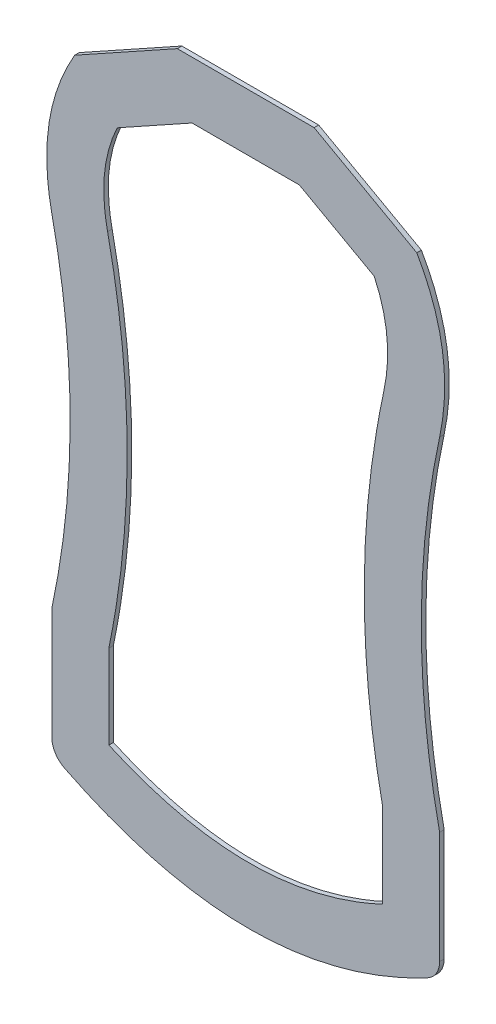
ISO-10303-21;
HEADER;
FILE_DESCRIPTION(('STEP AP214'),'2;1');
FILE_NAME('part.step','',(''),(''),'','','');
FILE_SCHEMA(('AUTOMOTIVE_DESIGN { 1 0 10303 214 1 1 1 1 }'));
ENDSEC;
DATA;
#1=APPLICATION_CONTEXT('core data for automotive mechanical design processes');
#2=APPLICATION_PROTOCOL_DEFINITION('international standard','automotive_design',2000,#1);
#3=PRODUCT_CONTEXT('',#1,'mechanical');
#4=PRODUCT('Part','Part','',(#3));
#5=PRODUCT_RELATED_PRODUCT_CATEGORY('part','',(#4));
#6=PRODUCT_DEFINITION_FORMATION('','',#4);
#7=PRODUCT_DEFINITION_CONTEXT('part definition',#1,'design');
#8=PRODUCT_DEFINITION('design','',#6,#7);
#9=PRODUCT_DEFINITION_SHAPE('','',#8);
#10=(LENGTH_UNIT() NAMED_UNIT(*) SI_UNIT(.MILLI.,.METRE.));
#11=(NAMED_UNIT(*) PLANE_ANGLE_UNIT() SI_UNIT($,.RADIAN.));
#12=(NAMED_UNIT(*) SI_UNIT($,.STERADIAN.) SOLID_ANGLE_UNIT());
#13=UNCERTAINTY_MEASURE_WITH_UNIT(LENGTH_MEASURE(1.E-05),#10,'distance_accuracy_value','');
#14=(GEOMETRIC_REPRESENTATION_CONTEXT(3) GLOBAL_UNCERTAINTY_ASSIGNED_CONTEXT((#13)) GLOBAL_UNIT_ASSIGNED_CONTEXT((#10,
#11,#12)) REPRESENTATION_CONTEXT('',''));
#15=CARTESIAN_POINT('',(0.,0.,0.));
#16=DIRECTION('',(0.,0.,1.));
#17=DIRECTION('',(1.,0.,0.));
#18=AXIS2_PLACEMENT_3D('',#15,#16,#17);
#19=CARTESIAN_POINT('',(-76.9738187891846,121.143252381259,2.));
#20=DIRECTION('',(0.,0.,1.));
#21=DIRECTION('',(1.,0.,0.));
#22=AXIS2_PLACEMENT_3D('',#19,#20,#21);
#23=PLANE('',#22);
#24=CARTESIAN_POINT('',(-1000238.87552942,19516.7154582189,2.));
#25=CARTESIAN_POINT('',(999898.092641495,7182.76188768329,2.));
#26=CARTESIAN_POINT('',(-999865.205028728,-33397.6662240604,2.));
#27=B_SPLINE_CURVE_WITH_KNOTS('',2,(#24,#25,#26),.UNSPECIFIED.,.F.,.F.,(3,3),(0.,1.),.UNSPECIFIED.);
#28=CARTESIAN_POINT('',(-84.9999999975347,193.614820304158,2.));
#29=VERTEX_POINT('',#28);
#30=CARTESIAN_POINT('',(-85.,43.6148203161552,2.));
#31=VERTEX_POINT('',#30);
#32=EDGE_CURVE('E312',#29,#31,#27,.T.);
#33=ORIENTED_EDGE('',*,*,#32,.T.);
#34=DIRECTION('',(0.,-1.,0.));
#35=VECTOR('',#34,1.);
#36=CARTESIAN_POINT('',(-85.,43.6148203161552,2.));
#37=LINE('',#36,#35);
#38=CARTESIAN_POINT('',(-85.,-5.29765057148733,2.));
#39=VERTEX_POINT('',#38);
#40=EDGE_CURVE('E415',#31,#39,#37,.T.);
#41=ORIENTED_EDGE('',*,*,#40,.T.);
#42=CARTESIAN_POINT('',(-75.,-5.29765057148733,2.));
#43=DIRECTION('',(0.,0.,1.));
#44=DIRECTION('',(1.,0.,0.));
#45=AXIS2_PLACEMENT_3D('',#42,#43,#44);
#46=CIRCLE('',#45,9.99999999999998);
#47=CARTESIAN_POINT('',(-79.4757984005765,-14.2400903212087,2.));
#48=VERTEX_POINT('',#47);
#49=EDGE_CURVE('E351',#39,#48,#46,.T.);
#50=ORIENTED_EDGE('',*,*,#49,.T.);
#51=CARTESIAN_POINT('',(-77869.890217819,997082.106704273,2.));
#52=CARTESIAN_POINT('',(60403.4764562875,-998209.20519559,2.));
#53=CARTESIAN_POINT('',(-42894.2550306342,999198.244961769,2.));
#54=B_SPLINE_CURVE_WITH_KNOTS('',2,(#51,#52,#53),.UNSPECIFIED.,.F.,.F.,(3,3),(0.,1.),.UNSPECIFIED.);
#55=CARTESIAN_POINT('',(79.6959362439127,-14.3068048238395,2.));
#56=VERTEX_POINT('',#55);
#57=EDGE_CURVE('E369',#48,#56,#54,.T.);
#58=ORIENTED_EDGE('',*,*,#57,.T.);
#59=CARTESIAN_POINT('',(75.,-5.47797801665959,2.));
#60=DIRECTION('',(0.,0.,1.));
#61=DIRECTION('',(1.,0.,0.));
#62=AXIS2_PLACEMENT_3D('',#59,#60,#61);
#63=CIRCLE('',#62,9.99999999999376);
#64=CARTESIAN_POINT('',(84.9999999999938,-5.47797801665959,2.));
#65=VERTEX_POINT('',#64);
#66=EDGE_CURVE('E366',#56,#65,#63,.T.);
#67=ORIENTED_EDGE('',*,*,#66,.T.);
#68=DIRECTION('',(0.,1.,0.));
#69=VECTOR('',#68,1.);
#70=CARTESIAN_POINT('',(85.,-5.47797801665959,2.));
#71=LINE('',#70,#69);
#72=CARTESIAN_POINT('',(85.,43.6148203161552,2.));
#73=VERTEX_POINT('',#72);
#74=EDGE_CURVE('E368',#65,#73,#71,.T.);
#75=ORIENTED_EDGE('',*,*,#74,.T.);
#76=CARTESIAN_POINT('',(999865.205028728,-33397.6662240645,2.));
#77=CARTESIAN_POINT('',(-999898.092641495,7182.76188768427,2.));
#78=CARTESIAN_POINT('',(1000238.87552942,19516.7154582207,2.));
#79=B_SPLINE_CURVE_WITH_KNOTS('',2,(#76,#77,#78),.UNSPECIFIED.,.F.,.F.,(3,3),(0.,1.),.UNSPECIFIED.);
#80=CARTESIAN_POINT('',(85.0000000003506,193.614820317745,2.));
#81=VERTEX_POINT('',#80);
#82=EDGE_CURVE('E371',#73,#81,#79,.T.);
#83=ORIENTED_EDGE('',*,*,#82,.T.);
#84=CARTESIAN_POINT('',(-979400.541261937,-201703.6557811,2.));
#85=CARTESIAN_POINT('',(982042.052969955,189337.995737097,2.));
#86=CARTESIAN_POINT('',(-984340.899723838,-176050.437364522,2.));
#87=B_SPLINE_CURVE_WITH_KNOTS('',2,(#84,#85,#86),.UNSPECIFIED.,.F.,.F.,(3,3),(0.,1.),.UNSPECIFIED.);
#88=CARTESIAN_POINT('',(74.9999998616335,258.614820554969,2.));
#89=VERTEX_POINT('',#88);
#90=EDGE_CURVE('E383',#81,#89,#87,.T.);
#91=ORIENTED_EDGE('',*,*,#90,.T.);
#92=DIRECTION('',(-0.87415727678954,0.485642929976229,0.));
#93=VECTOR('',#92,1.);
#94=CARTESIAN_POINT('',(74.9999999308137,258.614820435594,2.));
#95=LINE('',#94,#93);
#96=CARTESIAN_POINT('',(30.,283.614820316155,2.));
#97=VERTEX_POINT('',#96);
#98=EDGE_CURVE('E439',#89,#97,#95,.T.);
#99=ORIENTED_EDGE('',*,*,#98,.T.);
#100=DIRECTION('',(-1.,0.,0.));
#101=VECTOR('',#100,1.);
#102=CARTESIAN_POINT('',(30.,283.614820316155,2.));
#103=LINE('',#102,#101);
#104=CARTESIAN_POINT('',(-30.,283.614820316155,2.));
#105=VERTEX_POINT('',#104);
#106=EDGE_CURVE('E430',#97,#105,#103,.T.);
#107=ORIENTED_EDGE('',*,*,#106,.T.);
#108=DIRECTION('',(-0.874157276121537,-0.485642931178634,0.));
#109=VECTOR('',#108,1.);
#110=CARTESIAN_POINT('',(-30.,283.614820316155,2.));
#111=LINE('',#110,#109);
#112=CARTESIAN_POINT('',(-75.,258.614820316155,2.));
#113=VERTEX_POINT('',#112);
#114=EDGE_CURVE('E261',#105,#113,#111,.T.);
#115=ORIENTED_EDGE('',*,*,#114,.T.);
#116=CARTESIAN_POINT('',(984340.899723838,-176050.437364521,2.));
#117=CARTESIAN_POINT('',(-982042.052969956,189337.995737094,2.));
#118=CARTESIAN_POINT('',(979400.541261938,-201703.655781094,2.));
#119=B_SPLINE_CURVE_WITH_KNOTS('',2,(#116,#117,#118),.UNSPECIFIED.,.F.,.F.,(3,3),(0.,1.),.UNSPECIFIED.);
#120=EDGE_CURVE('E254',#113,#29,#119,.T.);
#121=ORIENTED_EDGE('',*,*,#120,.T.);
#122=EDGE_LOOP('',(#33,#41,#50,#58,#67,#75,#83,#91,#99,#107,#115,#121));
#123=FACE_BOUND('',#122,.T.);
#124=DIRECTION('',(-8.52301327763965E-12,1.,0.));
#125=VECTOR('',#124,1.);
#126=CARTESIAN_POINT('',(60.0000000000006,3.79043038604827,2.));
#127=LINE('',#126,#125);
#128=CARTESIAN_POINT('',(60.0000000000006,3.79043038604827,2.));
#129=VERTEX_POINT('',#128);
#130=CARTESIAN_POINT('',(59.9999999996833,41.0135529890441,2.));
#131=VERTEX_POINT('',#130);
#132=EDGE_CURVE('E197',#129,#131,#127,.T.);
#133=ORIENTED_EDGE('',*,*,#132,.F.);
#134=CARTESIAN_POINT('',(-59.9999999985744,4.19691995283315,2.));
#135=CARTESIAN_POINT('',(-58.6755498252806,3.60723733508615,2.));
#136=CARTESIAN_POINT('',(-55.9979113155388,2.4511079803945,2.));
#137=CARTESIAN_POINT('',(-50.7144017792948,0.31362506621307,2.));
#138=CARTESIAN_POINT('',(-44.1582719851266,-2.07138511945108,2.));
#139=CARTESIAN_POINT('',(-36.3927742100887,-4.47105772516419,2.));
#140=CARTESIAN_POINT('',(-26.159032522355,-7.07010000079152,2.));
#141=CARTESIAN_POINT('',(-13.5817743786078,-9.21291655889772,2.));
#142=CARTESIAN_POINT('',(1.24439365844762,-10.0745525897548,2.));
#143=CARTESIAN_POINT('',(15.907593171899,-9.25837708174665,2.));
#144=CARTESIAN_POINT('',(28.0853923629384,-7.17597824513762,2.));
#145=CARTESIAN_POINT('',(37.8532748668454,-4.64734988569241,2.));
#146=CARTESIAN_POINT('',(45.2002411230977,-2.31212286898567,2.));
#147=CARTESIAN_POINT('',(51.3517864480515,0.00897374498053062,2.));
#148=CARTESIAN_POINT('',(56.2823816259972,2.09043393425648,2.));
#149=CARTESIAN_POINT('',(58.7696713385722,3.21546819865244,2.));
#150=CARTESIAN_POINT('',(59.999999999674,3.79043038587958,2.));
#151=B_SPLINE_CURVE_WITH_KNOTS('',3,(#134,#135,#136,#137,#138,#139,#140,#141,#142,#143,#144,
#145,#146,#147,#148,#149,#150),.UNSPECIFIED.,.F.,.F.,(4,1,1,1,1,1,1,1,1,1,1,1,1,1,4),
(0.497723600916003,0.497848890223069,0.497974179530135,0.498224758144267,0.498475336758399,
0.498725915372531,0.499227072600795,0.49972822982906,0.500229387057324,0.500730544285588,
0.50098112289972,0.501231701513852,0.501482280127984,0.50160756943505,0.501732858742116),.UNSPECIFIED.);
#152=CARTESIAN_POINT('',(-60.,4.19691995348408,2.));
#153=VERTEX_POINT('',#152);
#154=EDGE_CURVE('E189',#153,#129,#151,.T.);
#155=ORIENTED_EDGE('',*,*,#154,.F.);
#156=DIRECTION('',(-3.85460463139452E-11,-1.,0.));
#157=VECTOR('',#156,1.);
#158=CARTESIAN_POINT('',(-59.9999999985809,41.013552994777,2.));
#159=LINE('',#158,#157);
#160=CARTESIAN_POINT('',(-59.9999999985809,41.013552994777,2.));
#161=VERTEX_POINT('',#160);
#162=EDGE_CURVE('E468',#161,#153,#159,.T.);
#163=ORIENTED_EDGE('',*,*,#162,.F.);
#164=CARTESIAN_POINT('',(-60.5518036788972,198.838435744556,2.));
#165=CARTESIAN_POINT('',(-59.8507818348682,195.570734160217,2.));
#166=CARTESIAN_POINT('',(-58.5294279298967,189.008184891731,2.));
#167=CARTESIAN_POINT('',(-56.235628136031,175.893497532565,2.));
#168=CARTESIAN_POINT('',(-54.0125597568879,159.468210820783,2.));
#169=CARTESIAN_POINT('',(-52.3832661573371,139.733385525824,2.));
#170=CARTESIAN_POINT('',(-51.7938623271296,119.980130065386,2.));
#171=CARTESIAN_POINT('',(-52.24550963628,100.220261153747,2.));
#172=CARTESIAN_POINT('',(-53.7369672804113,80.4656329934158,2.));
#173=CARTESIAN_POINT('',(-55.8450474598927,64.0126670518682,2.));
#174=CARTESIAN_POINT('',(-58.0467566435136,50.8693977377071,2.));
#175=CARTESIAN_POINT('',(-59.322028051379,44.2898776409661,2.));
#176=CARTESIAN_POINT('',(-59.9999999985809,41.013552994777,2.));
#177=B_SPLINE_CURVE_WITH_KNOTS('',3,(#164,#165,#166,#167,#168,#169,#170,#171,#172,#173,#174,
#175,#176),.UNSPECIFIED.,.F.,.F.,(4,1,1,1,1,1,1,1,1,1,4),(0.498629781459366,0.498804014890937,
0.498978248322508,0.499326715185649,0.49967518204879,0.500023648911932,0.500372115775073,
0.500720582638215,0.501069049501356,0.501243282932927,0.501417516364497),.UNSPECIFIED.);
#178=CARTESIAN_POINT('',(-60.5518036788972,198.838435744556,2.));
#179=VERTEX_POINT('',#178);
#180=EDGE_CURVE('E520',#179,#161,#177,.T.);
#181=ORIENTED_EDGE('',*,*,#180,.F.);
#182=CARTESIAN_POINT('',(-56.3418242693007,240.381500886034,2.));
#183=CARTESIAN_POINT('',(-56.718745321308,239.571152450954,2.));
#184=CARTESIAN_POINT('',(-57.4453510433068,237.924368375815,2.));
#185=CARTESIAN_POINT('',(-58.7287503145898,234.663821571476,2.));
#186=CARTESIAN_POINT('',(-60.053818229448,230.576058741989,2.));
#187=CARTESIAN_POINT('',(-61.2107111474539,225.635955513875,2.));
#188=CARTESIAN_POINT('',(-61.9505894168255,220.61325517187,2.));
#189=CARTESIAN_POINT('',(-62.275188623841,215.464331422085,2.));
#190=CARTESIAN_POINT('',(-62.1768397649011,210.149450120039,2.));
#191=CARTESIAN_POINT('',(-61.7262675421507,205.544999397166,2.));
#192=CARTESIAN_POINT('',(-61.1366178504968,201.760314579981,2.));
#193=CARTESIAN_POINT('',(-60.7570121682482,199.803498507837,2.));
#194=CARTESIAN_POINT('',(-60.5518036788992,198.838435744549,2.));
#195=B_SPLINE_CURVE_WITH_KNOTS('',3,(#182,#183,#184,#185,#186,#187,#188,#189,#190,#191,#192,
#193,#194),.UNSPECIFIED.,.F.,.F.,(4,1,1,1,1,1,1,1,1,1,4),(0.499183132805836,0.499320423136845,
0.499457713467854,0.499732294129871,0.500006874791889,0.500281455453906,0.500556036115924,
0.500830616777941,0.501105197439959,0.501242487770967,0.501379778101976),.UNSPECIFIED.);
#196=CARTESIAN_POINT('',(-56.3418242693007,240.381500886034,2.));
#197=VERTEX_POINT('',#196);
#198=EDGE_CURVE('E525',#197,#179,#195,.T.);
#199=ORIENTED_EDGE('',*,*,#198,.F.);
#200=DIRECTION('',(-0.874157276121642,-0.485642931178444,0.));
#201=VECTOR('',#200,1.);
#202=CARTESIAN_POINT('',(-23.521849295065,258.614820316155,2.));
#203=LINE('',#202,#201);
#204=CARTESIAN_POINT('',(-23.521849295065,258.614820316155,2.));
#205=VERTEX_POINT('',#204);
#206=EDGE_CURVE('E568',#205,#197,#203,.T.);
#207=ORIENTED_EDGE('',*,*,#206,.F.);
#208=DIRECTION('',(-1.,0.,0.));
#209=VECTOR('',#208,1.);
#210=CARTESIAN_POINT('',(23.521849295065,258.614820316155,2.));
#211=LINE('',#210,#209);
#212=CARTESIAN_POINT('',(23.521849295065,258.614820316155,2.));
#213=VERTEX_POINT('',#212);
#214=EDGE_CURVE('E567',#213,#205,#211,.T.);
#215=ORIENTED_EDGE('',*,*,#214,.F.);
#216=DIRECTION('',(-0.874157276904845,0.48564292976868,0.));
#217=VECTOR('',#216,1.);
#218=CARTESIAN_POINT('',(56.3418242256315,240.38150097956,2.));
#219=LINE('',#218,#217);
#220=CARTESIAN_POINT('',(56.3418242256315,240.38150097956,2.));
#221=VERTEX_POINT('',#220);
#222=EDGE_CURVE('E566',#221,#213,#219,.T.);
#223=ORIENTED_EDGE('',*,*,#222,.F.);
#224=CARTESIAN_POINT('',(60.5518036801037,198.838435750615,2.));
#225=CARTESIAN_POINT('',(60.7570121698237,199.803498516004,2.));
#226=CARTESIAN_POINT('',(61.13661785267,201.760314592465,2.));
#227=CARTESIAN_POINT('',(61.7262675447728,205.544999417723,2.));
#228=CARTESIAN_POINT('',(62.1768397669183,210.149450150157,2.));
#229=CARTESIAN_POINT('',(62.2751886230896,215.464331462897,2.));
#230=CARTESIAN_POINT('',(61.9505894117267,220.613255222943,2.));
#231=CARTESIAN_POINT('',(61.210711135976,225.63595557508,2.));
#232=CARTESIAN_POINT('',(60.0538182096739,230.576058813487,2.));
#233=CARTESIAN_POINT('',(58.7287502861641,234.663821651916,2.));
#234=CARTESIAN_POINT('',(57.4453510066032,237.924368463601,2.));
#235=CARTESIAN_POINT('',(56.7187452799808,239.571152542642,2.));
#236=CARTESIAN_POINT('',(56.3418242256315,240.38150097956,2.));
#237=B_SPLINE_CURVE_WITH_KNOTS('',3,(#224,#225,#226,#227,#228,#229,#230,#231,#232,#233,#234,
#235,#236),.UNSPECIFIED.,.F.,.F.,(4,1,1,1,1,1,1,1,1,1,4),(0.498620221898313,0.498757512229631,
0.498894802560949,0.499169383223585,0.499443963886221,0.499718544548856,0.499993125211492,
0.500267705874128,0.500542286536764,0.500679576868082,0.5008168671994),.UNSPECIFIED.);
#238=CARTESIAN_POINT('',(60.5518036801037,198.838435750615,2.));
#239=VERTEX_POINT('',#238);
#240=EDGE_CURVE('E212',#239,#221,#237,.T.);
#241=ORIENTED_EDGE('',*,*,#240,.F.);
#242=CARTESIAN_POINT('',(59.9999999996833,41.0135529890441,2.));
#243=CARTESIAN_POINT('',(59.3220280523818,44.2898776354769,2.));
#244=CARTESIAN_POINT('',(58.0467566442747,50.8693977327055,2.));
#245=CARTESIAN_POINT('',(55.8450474604073,64.0126670478516,2.));
#246=CARTESIAN_POINT('',(53.736967280585,80.4656329906216,2.));
#247=CARTESIAN_POINT('',(52.2455096361998,100.22026115244,2.));
#248=CARTESIAN_POINT('',(51.7938623269824,119.980130065553,2.));
#249=CARTESIAN_POINT('',(52.3832661573241,139.733385527476,2.));
#250=CARTESIAN_POINT('',(54.0125597571221,159.468210823909,2.));
#251=CARTESIAN_POINT('',(56.2356281365632,175.893497536922,2.));
#252=CARTESIAN_POINT('',(58.5294279308538,189.008184897056,2.));
#253=CARTESIAN_POINT('',(59.8507818359719,195.570734166037,2.));
#254=CARTESIAN_POINT('',(60.5518036801058,198.838435750614,2.));
#255=B_SPLINE_CURVE_WITH_KNOTS('',3,(#242,#243,#244,#245,#246,#247,#248,#249,#250,#251,#252,
#253,#254),.UNSPECIFIED.,.F.,.F.,(4,1,1,1,1,1,1,1,1,1,4),(0.498582483635403,0.498756717066987,
0.49893095049857,0.499279417361738,0.499627884224905,0.499976351088073,0.50032481795124,
0.500673284814408,0.501021751677575,0.501195985109159,0.501370218540742),.UNSPECIFIED.);
#256=EDGE_CURVE('E210',#131,#239,#255,.T.);
#257=ORIENTED_EDGE('',*,*,#256,.F.);
#258=EDGE_LOOP('',(#133,#155,#163,#181,#199,#207,#215,#223,#241,#257));
#259=FACE_BOUND('',#258,.T.);
#260=ADVANCED_FACE('F39',(#123,#259),#23,.T.);
#261=CARTESIAN_POINT('',(-76.9738187891846,121.143252381259,0.));
#262=DIRECTION('',(0.,0.,1.));
#263=DIRECTION('',(1.,0.,0.));
#264=AXIS2_PLACEMENT_3D('',#261,#262,#263);
#265=PLANE('',#264);
#266=CARTESIAN_POINT('',(-1000238.87552942,19516.7154582189,0.));
#267=CARTESIAN_POINT('',(999898.092641495,7182.76188768329,0.));
#268=CARTESIAN_POINT('',(-999865.205028728,-33397.6662240604,0.));
#269=B_SPLINE_CURVE_WITH_KNOTS('',2,(#266,#267,#268),.UNSPECIFIED.,.F.,.F.,(3,3),(0.,1.),.UNSPECIFIED.);
#270=CARTESIAN_POINT('',(-84.9999999975347,193.614820304158,0.));
#271=VERTEX_POINT('',#270);
#272=CARTESIAN_POINT('',(-85.,43.6148203161552,0.));
#273=VERTEX_POINT('',#272);
#274=EDGE_CURVE('E205',#271,#273,#269,.T.);
#275=ORIENTED_EDGE('',*,*,#274,.F.);
#276=CARTESIAN_POINT('',(984340.899723838,-176050.437364521,0.));
#277=CARTESIAN_POINT('',(-982042.052969956,189337.995737094,0.));
#278=CARTESIAN_POINT('',(979400.541261938,-201703.655781094,0.));
#279=B_SPLINE_CURVE_WITH_KNOTS('',2,(#276,#277,#278),.UNSPECIFIED.,.F.,.F.,(3,3),(0.,1.),.UNSPECIFIED.);
#280=CARTESIAN_POINT('',(-75.,258.614820316155,0.));
#281=VERTEX_POINT('',#280);
#282=EDGE_CURVE('E308',#281,#271,#279,.T.);
#283=ORIENTED_EDGE('',*,*,#282,.F.);
#284=DIRECTION('',(-0.874157276121537,-0.485642931178634,0.));
#285=VECTOR('',#284,1.);
#286=CARTESIAN_POINT('',(-30.,283.614820316155,0.));
#287=LINE('',#286,#285);
#288=CARTESIAN_POINT('',(-30.,283.614820316155,0.));
#289=VERTEX_POINT('',#288);
#290=EDGE_CURVE('E306',#289,#281,#287,.T.);
#291=ORIENTED_EDGE('',*,*,#290,.F.);
#292=DIRECTION('',(-1.,0.,0.));
#293=VECTOR('',#292,1.);
#294=CARTESIAN_POINT('',(30.,283.614820316155,0.));
#295=LINE('',#294,#293);
#296=CARTESIAN_POINT('',(30.,283.614820316155,0.));
#297=VERTEX_POINT('',#296);
#298=EDGE_CURVE('E304',#297,#289,#295,.T.);
#299=ORIENTED_EDGE('',*,*,#298,.F.);
#300=DIRECTION('',(-0.87415727678954,0.485642929976229,0.));
#301=VECTOR('',#300,1.);
#302=CARTESIAN_POINT('',(74.9999999308137,258.614820435594,0.));
#303=LINE('',#302,#301);
#304=CARTESIAN_POINT('',(74.9999998616335,258.614820554969,0.));
#305=VERTEX_POINT('',#304);
#306=EDGE_CURVE('E299',#305,#297,#303,.T.);
#307=ORIENTED_EDGE('',*,*,#306,.F.);
#308=CARTESIAN_POINT('',(-979400.541261937,-201703.6557811,0.));
#309=CARTESIAN_POINT('',(982042.052969955,189337.995737097,0.));
#310=CARTESIAN_POINT('',(-984340.899723838,-176050.437364522,0.));
#311=B_SPLINE_CURVE_WITH_KNOTS('',2,(#308,#309,#310),.UNSPECIFIED.,.F.,.F.,(3,3),(0.,1.),.UNSPECIFIED.);
#312=CARTESIAN_POINT('',(85.0000000003506,193.614820317745,0.));
#313=VERTEX_POINT('',#312);
#314=EDGE_CURVE('E292',#313,#305,#311,.T.);
#315=ORIENTED_EDGE('',*,*,#314,.F.);
#316=CARTESIAN_POINT('',(999865.205028728,-33397.6662240645,0.));
#317=CARTESIAN_POINT('',(-999898.092641495,7182.76188768427,0.));
#318=CARTESIAN_POINT('',(1000238.87552942,19516.7154582207,0.));
#319=B_SPLINE_CURVE_WITH_KNOTS('',2,(#316,#317,#318),.UNSPECIFIED.,.F.,.F.,(3,3),(0.,1.),.UNSPECIFIED.);
#320=CARTESIAN_POINT('',(85.,43.6148203161552,0.));
#321=VERTEX_POINT('',#320);
#322=EDGE_CURVE('E288',#321,#313,#319,.T.);
#323=ORIENTED_EDGE('',*,*,#322,.F.);
#324=DIRECTION('',(0.,1.,0.));
#325=VECTOR('',#324,1.);
#326=CARTESIAN_POINT('',(85.,-5.47797801665959,0.));
#327=LINE('',#326,#325);
#328=CARTESIAN_POINT('',(84.9999999999938,-5.47797801665959,0.));
#329=VERTEX_POINT('',#328);
#330=EDGE_CURVE('E286',#329,#321,#327,.T.);
#331=ORIENTED_EDGE('',*,*,#330,.F.);
#332=CARTESIAN_POINT('',(75.,-5.47797801665959,0.));
#333=DIRECTION('',(0.,0.,1.));
#334=DIRECTION('',(1.,0.,0.));
#335=AXIS2_PLACEMENT_3D('',#332,#333,#334);
#336=CIRCLE('',#335,9.99999999999376);
#337=CARTESIAN_POINT('',(79.6959362439127,-14.3068048238395,0.));
#338=VERTEX_POINT('',#337);
#339=EDGE_CURVE('E281',#338,#329,#336,.T.);
#340=ORIENTED_EDGE('',*,*,#339,.F.);
#341=CARTESIAN_POINT('',(-77869.890217819,997082.106704273,0.));
#342=CARTESIAN_POINT('',(60403.4764562875,-998209.20519559,0.));
#343=CARTESIAN_POINT('',(-42894.2550306342,999198.244961769,0.));
#344=B_SPLINE_CURVE_WITH_KNOTS('',2,(#341,#342,#343),.UNSPECIFIED.,.F.,.F.,(3,3),(0.,1.),.UNSPECIFIED.);
#345=CARTESIAN_POINT('',(-79.4757984005765,-14.2400903212087,0.));
#346=VERTEX_POINT('',#345);
#347=EDGE_CURVE('E277',#346,#338,#344,.T.);
#348=ORIENTED_EDGE('',*,*,#347,.F.);
#349=CARTESIAN_POINT('',(-75.,-5.29765057148733,0.));
#350=DIRECTION('',(0.,0.,1.));
#351=DIRECTION('',(1.,0.,0.));
#352=AXIS2_PLACEMENT_3D('',#349,#350,#351);
#353=CIRCLE('',#352,9.99999999999998);
#354=CARTESIAN_POINT('',(-85.,-5.29765057148733,0.));
#355=VERTEX_POINT('',#354);
#356=EDGE_CURVE('E275',#355,#346,#353,.T.);
#357=ORIENTED_EDGE('',*,*,#356,.F.);
#358=DIRECTION('',(0.,-1.,0.));
#359=VECTOR('',#358,1.);
#360=CARTESIAN_POINT('',(-85.,43.6148203161552,0.));
#361=LINE('',#360,#359);
#362=EDGE_CURVE('E270',#273,#355,#361,.T.);
#363=ORIENTED_EDGE('',*,*,#362,.F.);
#364=EDGE_LOOP('',(#275,#283,#291,#299,#307,#315,#323,#331,#340,#348,#357,#363));
#365=FACE_BOUND('',#364,.T.);
#366=CARTESIAN_POINT('',(-59.9999999985744,4.19691995283315,0.));
#367=CARTESIAN_POINT('',(-58.6755498252806,3.60723733508615,0.));
#368=CARTESIAN_POINT('',(-55.9979113155388,2.4511079803945,0.));
#369=CARTESIAN_POINT('',(-50.7144017792948,0.31362506621307,0.));
#370=CARTESIAN_POINT('',(-44.1582719851266,-2.07138511945108,0.));
#371=CARTESIAN_POINT('',(-36.3927742100887,-4.47105772516419,0.));
#372=CARTESIAN_POINT('',(-26.159032522355,-7.07010000079152,0.));
#373=CARTESIAN_POINT('',(-13.5817743786078,-9.21291655889772,0.));
#374=CARTESIAN_POINT('',(1.24439365844762,-10.0745525897548,0.));
#375=CARTESIAN_POINT('',(15.907593171899,-9.25837708174665,0.));
#376=CARTESIAN_POINT('',(28.0853923629384,-7.17597824513762,0.));
#377=CARTESIAN_POINT('',(37.8532748668454,-4.64734988569241,0.));
#378=CARTESIAN_POINT('',(45.2002411230977,-2.31212286898567,0.));
#379=CARTESIAN_POINT('',(51.3517864480515,0.00897374498053062,0.));
#380=CARTESIAN_POINT('',(56.2823816259972,2.09043393425648,0.));
#381=CARTESIAN_POINT('',(58.7696713385722,3.21546819865244,0.));
#382=CARTESIAN_POINT('',(59.999999999674,3.79043038587958,0.));
#383=B_SPLINE_CURVE_WITH_KNOTS('',3,(#366,#367,#368,#369,#370,#371,#372,#373,#374,#375,#376,
#377,#378,#379,#380,#381,#382),.UNSPECIFIED.,.F.,.F.,(4,1,1,1,1,1,1,1,1,1,1,1,1,1,4),
(0.497723600916003,0.497848890223069,0.497974179530135,0.498224758144267,0.498475336758399,
0.498725915372531,0.499227072600795,0.49972822982906,0.500229387057324,0.500730544285588,
0.50098112289972,0.501231701513852,0.501482280127984,0.50160756943505,0.501732858742116),.UNSPECIFIED.);
#384=CARTESIAN_POINT('',(-60.,4.19691995348409,0.));
#385=VERTEX_POINT('',#384);
#386=CARTESIAN_POINT('',(60.0000000000006,3.79043038604827,0.));
#387=VERTEX_POINT('',#386);
#388=EDGE_CURVE('E63',#385,#387,#383,.T.);
#389=ORIENTED_EDGE('',*,*,#388,.T.);
#390=DIRECTION('',(-8.52301327763965E-12,1.,0.));
#391=VECTOR('',#390,1.);
#392=CARTESIAN_POINT('',(60.0000000000006,3.79043038604827,0.));
#393=LINE('',#392,#391);
#394=CARTESIAN_POINT('',(59.9999999996833,41.0135529890441,0.));
#395=VERTEX_POINT('',#394);
#396=EDGE_CURVE('E204',#387,#395,#393,.T.);
#397=ORIENTED_EDGE('',*,*,#396,.T.);
#398=CARTESIAN_POINT('',(59.9999999996833,41.0135529890441,0.));
#399=CARTESIAN_POINT('',(59.3220280523818,44.2898776354769,0.));
#400=CARTESIAN_POINT('',(58.0467566442747,50.8693977327055,0.));
#401=CARTESIAN_POINT('',(55.8450474604073,64.0126670478516,0.));
#402=CARTESIAN_POINT('',(53.736967280585,80.4656329906216,0.));
#403=CARTESIAN_POINT('',(52.2455096361998,100.22026115244,0.));
#404=CARTESIAN_POINT('',(51.7938623269824,119.980130065553,0.));
#405=CARTESIAN_POINT('',(52.3832661573241,139.733385527476,0.));
#406=CARTESIAN_POINT('',(54.0125597571221,159.468210823909,0.));
#407=CARTESIAN_POINT('',(56.2356281365632,175.893497536922,0.));
#408=CARTESIAN_POINT('',(58.5294279308538,189.008184897056,0.));
#409=CARTESIAN_POINT('',(59.8507818359719,195.570734166037,0.));
#410=CARTESIAN_POINT('',(60.5518036801058,198.838435750614,0.));
#411=B_SPLINE_CURVE_WITH_KNOTS('',3,(#398,#399,#400,#401,#402,#403,#404,#405,#406,#407,#408,
#409,#410),.UNSPECIFIED.,.F.,.F.,(4,1,1,1,1,1,1,1,1,1,4),(0.498582483635403,0.498756717066987,
0.49893095049857,0.499279417361738,0.499627884224905,0.499976351088073,0.50032481795124,
0.500673284814408,0.501021751677575,0.501195985109159,0.501370218540742),.UNSPECIFIED.);
#412=CARTESIAN_POINT('',(60.5518036801037,198.838435750615,0.));
#413=VERTEX_POINT('',#412);
#414=EDGE_CURVE('E501',#395,#413,#411,.T.);
#415=ORIENTED_EDGE('',*,*,#414,.T.);
#416=CARTESIAN_POINT('',(60.5518036801037,198.838435750615,0.));
#417=CARTESIAN_POINT('',(60.7570121698237,199.803498516004,0.));
#418=CARTESIAN_POINT('',(61.13661785267,201.760314592465,0.));
#419=CARTESIAN_POINT('',(61.7262675447728,205.544999417723,0.));
#420=CARTESIAN_POINT('',(62.1768397669183,210.149450150157,0.));
#421=CARTESIAN_POINT('',(62.2751886230896,215.464331462897,0.));
#422=CARTESIAN_POINT('',(61.9505894117267,220.613255222943,0.));
#423=CARTESIAN_POINT('',(61.210711135976,225.63595557508,0.));
#424=CARTESIAN_POINT('',(60.0538182096739,230.576058813487,0.));
#425=CARTESIAN_POINT('',(58.7287502861641,234.663821651916,0.));
#426=CARTESIAN_POINT('',(57.4453510066032,237.924368463601,0.));
#427=CARTESIAN_POINT('',(56.7187452799808,239.571152542642,0.));
#428=CARTESIAN_POINT('',(56.3418242256315,240.38150097956,0.));
#429=B_SPLINE_CURVE_WITH_KNOTS('',3,(#416,#417,#418,#419,#420,#421,#422,#423,#424,#425,#426,
#427,#428),.UNSPECIFIED.,.F.,.F.,(4,1,1,1,1,1,1,1,1,1,4),(0.498620221898313,0.498757512229631,
0.498894802560949,0.499169383223585,0.499443963886221,0.499718544548856,0.499993125211492,
0.500267705874128,0.500542286536764,0.500679576868082,0.5008168671994),.UNSPECIFIED.);
#430=CARTESIAN_POINT('',(56.3418242256315,240.38150097956,0.));
#431=VERTEX_POINT('',#430);
#432=EDGE_CURVE('E496',#413,#431,#429,.T.);
#433=ORIENTED_EDGE('',*,*,#432,.T.);
#434=DIRECTION('',(-0.874157276904845,0.48564292976868,0.));
#435=VECTOR('',#434,1.);
#436=CARTESIAN_POINT('',(56.3418242256315,240.38150097956,0.));
#437=LINE('',#436,#435);
#438=CARTESIAN_POINT('',(23.521849295065,258.614820316155,0.));
#439=VERTEX_POINT('',#438);
#440=EDGE_CURVE('E493',#431,#439,#437,.T.);
#441=ORIENTED_EDGE('',*,*,#440,.T.);
#442=DIRECTION('',(-1.,0.,0.));
#443=VECTOR('',#442,1.);
#444=CARTESIAN_POINT('',(23.521849295065,258.614820316155,0.));
#445=LINE('',#444,#443);
#446=CARTESIAN_POINT('',(-23.521849295065,258.614820316155,0.));
#447=VERTEX_POINT('',#446);
#448=EDGE_CURVE('E490',#439,#447,#445,.T.);
#449=ORIENTED_EDGE('',*,*,#448,.T.);
#450=DIRECTION('',(-0.874157276121642,-0.485642931178444,0.));
#451=VECTOR('',#450,1.);
#452=CARTESIAN_POINT('',(-23.521849295065,258.614820316155,0.));
#453=LINE('',#452,#451);
#454=CARTESIAN_POINT('',(-56.3418242693007,240.381500886034,0.));
#455=VERTEX_POINT('',#454);
#456=EDGE_CURVE('E484',#447,#455,#453,.T.);
#457=ORIENTED_EDGE('',*,*,#456,.T.);
#458=CARTESIAN_POINT('',(-56.3418242693007,240.381500886034,0.));
#459=CARTESIAN_POINT('',(-56.718745321308,239.571152450954,0.));
#460=CARTESIAN_POINT('',(-57.4453510433068,237.924368375815,0.));
#461=CARTESIAN_POINT('',(-58.7287503145898,234.663821571476,0.));
#462=CARTESIAN_POINT('',(-60.053818229448,230.576058741989,0.));
#463=CARTESIAN_POINT('',(-61.2107111474539,225.635955513875,0.));
#464=CARTESIAN_POINT('',(-61.9505894168255,220.61325517187,0.));
#465=CARTESIAN_POINT('',(-62.275188623841,215.464331422085,0.));
#466=CARTESIAN_POINT('',(-62.1768397649011,210.149450120039,0.));
#467=CARTESIAN_POINT('',(-61.7262675421507,205.544999397166,0.));
#468=CARTESIAN_POINT('',(-61.1366178504968,201.760314579981,0.));
#469=CARTESIAN_POINT('',(-60.7570121682482,199.803498507837,0.));
#470=CARTESIAN_POINT('',(-60.5518036788992,198.838435744549,0.));
#471=B_SPLINE_CURVE_WITH_KNOTS('',3,(#458,#459,#460,#461,#462,#463,#464,#465,#466,#467,#468,
#469,#470),.UNSPECIFIED.,.F.,.F.,(4,1,1,1,1,1,1,1,1,1,4),(0.499183132805836,0.499320423136845,
0.499457713467854,0.499732294129871,0.500006874791889,0.500281455453906,0.500556036115924,
0.500830616777941,0.501105197439959,0.501242487770967,0.501379778101976),.UNSPECIFIED.);
#472=CARTESIAN_POINT('',(-60.5518036788972,198.838435744556,0.));
#473=VERTEX_POINT('',#472);
#474=EDGE_CURVE('E476',#455,#473,#471,.T.);
#475=ORIENTED_EDGE('',*,*,#474,.T.);
#476=CARTESIAN_POINT('',(-60.5518036788972,198.838435744556,0.));
#477=CARTESIAN_POINT('',(-59.8507818348682,195.570734160217,0.));
#478=CARTESIAN_POINT('',(-58.5294279298967,189.008184891731,0.));
#479=CARTESIAN_POINT('',(-56.235628136031,175.893497532565,0.));
#480=CARTESIAN_POINT('',(-54.0125597568879,159.468210820783,0.));
#481=CARTESIAN_POINT('',(-52.3832661573371,139.733385525824,0.));
#482=CARTESIAN_POINT('',(-51.7938623271296,119.980130065386,0.));
#483=CARTESIAN_POINT('',(-52.24550963628,100.220261153747,0.));
#484=CARTESIAN_POINT('',(-53.7369672804113,80.4656329934158,0.));
#485=CARTESIAN_POINT('',(-55.8450474598927,64.0126670518682,0.));
#486=CARTESIAN_POINT('',(-58.0467566435136,50.8693977377071,0.));
#487=CARTESIAN_POINT('',(-59.322028051379,44.2898776409661,0.));
#488=CARTESIAN_POINT('',(-59.9999999985809,41.013552994777,0.));
#489=B_SPLINE_CURVE_WITH_KNOTS('',3,(#476,#477,#478,#479,#480,#481,#482,#483,#484,#485,#486,
#487,#488),.UNSPECIFIED.,.F.,.F.,(4,1,1,1,1,1,1,1,1,1,4),(0.498629781459366,0.498804014890937,
0.498978248322508,0.499326715185649,0.49967518204879,0.500023648911932,0.500372115775073,
0.500720582638215,0.501069049501356,0.501243282932927,0.501417516364497),.UNSPECIFIED.);
#490=CARTESIAN_POINT('',(-59.9999999985809,41.013552994777,0.));
#491=VERTEX_POINT('',#490);
#492=EDGE_CURVE('E471',#473,#491,#489,.T.);
#493=ORIENTED_EDGE('',*,*,#492,.T.);
#494=DIRECTION('',(-3.85460463139452E-11,-1.,0.));
#495=VECTOR('',#494,1.);
#496=CARTESIAN_POINT('',(-59.9999999985809,41.013552994777,0.));
#497=LINE('',#496,#495);
#498=EDGE_CURVE('E198',#491,#385,#497,.T.);
#499=ORIENTED_EDGE('',*,*,#498,.T.);
#500=EDGE_LOOP('',(#389,#397,#415,#433,#441,#449,#457,#475,#493,#499));
#501=FACE_BOUND('',#500,.T.);
#502=ADVANCED_FACE('F243',(#365,#501),#265,.F.);
#503=DIRECTION('',(0.,0.,-1.));
#504=VECTOR('',#503,1.);
#505=SURFACE_OF_LINEAR_EXTRUSION('',#27,#504);
#506=ORIENTED_EDGE('',*,*,#274,.T.);
#507=DIRECTION('',(0.,0.,-1.));
#508=VECTOR('',#507,1.);
#509=CARTESIAN_POINT('',(-85.,43.6148203161552,2.));
#510=LINE('',#509,#508);
#511=EDGE_CURVE('E11',#31,#273,#510,.T.);
#512=ORIENTED_EDGE('',*,*,#511,.F.);
#513=ORIENTED_EDGE('',*,*,#32,.F.);
#514=DIRECTION('',(0.,0.,-1.));
#515=VECTOR('',#514,1.);
#516=CARTESIAN_POINT('',(-84.9999999975347,193.614820304158,2.));
#517=LINE('',#516,#515);
#518=EDGE_CURVE('E260',#29,#271,#517,.T.);
#519=ORIENTED_EDGE('',*,*,#518,.T.);
#520=EDGE_LOOP('',(#506,#512,#513,#519));
#521=FACE_BOUND('',#520,.T.);
#522=ADVANCED_FACE('F41',(#521),#505,.F.);
#523=CARTESIAN_POINT('',(-85.,43.6148203161552,2.));
#524=DIRECTION('',(1.,0.,0.));
#525=DIRECTION('',(0.,0.,-1.));
#526=AXIS2_PLACEMENT_3D('',#523,#524,#525);
#527=PLANE('',#526);
#528=ORIENTED_EDGE('',*,*,#362,.T.);
#529=DIRECTION('',(0.,0.,-1.));
#530=VECTOR('',#529,1.);
#531=CARTESIAN_POINT('',(-85.,-5.29765057148733,2.));
#532=LINE('',#531,#530);
#533=EDGE_CURVE('E48',#39,#355,#532,.T.);
#534=ORIENTED_EDGE('',*,*,#533,.F.);
#535=ORIENTED_EDGE('',*,*,#40,.F.);
#536=ORIENTED_EDGE('',*,*,#511,.T.);
#537=EDGE_LOOP('',(#528,#534,#535,#536));
#538=FACE_BOUND('',#537,.T.);
#539=ADVANCED_FACE('F408',(#538),#527,.F.);
#540=CARTESIAN_POINT('',(-75.,-5.29765057148733,2.));
#541=DIRECTION('',(0.,0.,-1.));
#542=DIRECTION('',(-1.,0.,0.));
#543=AXIS2_PLACEMENT_3D('',#540,#541,#542);
#544=CYLINDRICAL_SURFACE('',#543,9.99999999999998);
#545=ORIENTED_EDGE('',*,*,#356,.T.);
#546=DIRECTION('',(0.,0.,-1.));
#547=VECTOR('',#546,1.);
#548=CARTESIAN_POINT('',(-79.4757984005765,-14.2400903212087,2.));
#549=LINE('',#548,#547);
#550=EDGE_CURVE('E342',#48,#346,#549,.T.);
#551=ORIENTED_EDGE('',*,*,#550,.F.);
#552=ORIENTED_EDGE('',*,*,#49,.F.);
#553=ORIENTED_EDGE('',*,*,#533,.T.);
#554=EDGE_LOOP('',(#545,#551,#552,#553));
#555=FACE_BOUND('',#554,.T.);
#556=ADVANCED_FACE('F349',(#555),#544,.T.);
#557=DIRECTION('',(0.,0.,-1.));
#558=VECTOR('',#557,1.);
#559=SURFACE_OF_LINEAR_EXTRUSION('',#54,#558);
#560=ORIENTED_EDGE('',*,*,#347,.T.);
#561=DIRECTION('',(0.,0.,-1.));
#562=VECTOR('',#561,1.);
#563=CARTESIAN_POINT('',(79.6959362439127,-14.3068048238395,2.));
#564=LINE('',#563,#562);
#565=EDGE_CURVE('E339',#56,#338,#564,.T.);
#566=ORIENTED_EDGE('',*,*,#565,.F.);
#567=ORIENTED_EDGE('',*,*,#57,.F.);
#568=ORIENTED_EDGE('',*,*,#550,.T.);
#569=EDGE_LOOP('',(#560,#566,#567,#568));
#570=FACE_BOUND('',#569,.T.);
#571=ADVANCED_FACE('F360',(#570),#559,.F.);
#572=CARTESIAN_POINT('',(75.,-5.47797801665959,2.));
#573=DIRECTION('',(0.,0.,-1.));
#574=DIRECTION('',(-1.,0.,0.));
#575=AXIS2_PLACEMENT_3D('',#572,#573,#574);
#576=CYLINDRICAL_SURFACE('',#575,9.99999999999376);
#577=ORIENTED_EDGE('',*,*,#339,.T.);
#578=DIRECTION('',(0.,0.,-1.));
#579=VECTOR('',#578,1.);
#580=CARTESIAN_POINT('',(84.9999999999938,-5.47797801665959,2.));
#581=LINE('',#580,#579);
#582=EDGE_CURVE('E336',#65,#329,#581,.T.);
#583=ORIENTED_EDGE('',*,*,#582,.F.);
#584=ORIENTED_EDGE('',*,*,#66,.F.);
#585=ORIENTED_EDGE('',*,*,#565,.T.);
#586=EDGE_LOOP('',(#577,#583,#584,#585));
#587=FACE_BOUND('',#586,.T.);
#588=ADVANCED_FACE('F364',(#587),#576,.T.);
#589=CARTESIAN_POINT('',(85.,-5.47797801665959,2.));
#590=DIRECTION('',(-1.,0.,0.));
#591=DIRECTION('',(0.,-1.,0.));
#592=AXIS2_PLACEMENT_3D('',#589,#590,#591);
#593=PLANE('',#592);
#594=ORIENTED_EDGE('',*,*,#330,.T.);
#595=DIRECTION('',(0.,0.,-1.));
#596=VECTOR('',#595,1.);
#597=CARTESIAN_POINT('',(85.,43.6148203161552,2.));
#598=LINE('',#597,#596);
#599=EDGE_CURVE('E333',#73,#321,#598,.T.);
#600=ORIENTED_EDGE('',*,*,#599,.F.);
#601=ORIENTED_EDGE('',*,*,#74,.F.);
#602=ORIENTED_EDGE('',*,*,#582,.T.);
#603=EDGE_LOOP('',(#594,#600,#601,#602));
#604=FACE_BOUND('',#603,.T.);
#605=ADVANCED_FACE('F397',(#604),#593,.F.);
#606=DIRECTION('',(0.,0.,-1.));
#607=VECTOR('',#606,1.);
#608=SURFACE_OF_LINEAR_EXTRUSION('',#79,#607);
#609=ORIENTED_EDGE('',*,*,#322,.T.);
#610=DIRECTION('',(0.,0.,-1.));
#611=VECTOR('',#610,1.);
#612=CARTESIAN_POINT('',(85.0000000003506,193.614820317745,2.));
#613=LINE('',#612,#611);
#614=EDGE_CURVE('E330',#81,#313,#613,.T.);
#615=ORIENTED_EDGE('',*,*,#614,.F.);
#616=ORIENTED_EDGE('',*,*,#82,.F.);
#617=ORIENTED_EDGE('',*,*,#599,.T.);
#618=EDGE_LOOP('',(#609,#615,#616,#617));
#619=FACE_BOUND('',#618,.T.);
#620=ADVANCED_FACE('F392',(#619),#608,.F.);
#621=DIRECTION('',(0.,0.,-1.));
#622=VECTOR('',#621,1.);
#623=SURFACE_OF_LINEAR_EXTRUSION('',#87,#622);
#624=ORIENTED_EDGE('',*,*,#314,.T.);
#625=DIRECTION('',(0.,0.,-1.));
#626=VECTOR('',#625,1.);
#627=CARTESIAN_POINT('',(74.9999998616335,258.614820554969,2.));
#628=LINE('',#627,#626);
#629=EDGE_CURVE('E327',#89,#305,#628,.T.);
#630=ORIENTED_EDGE('',*,*,#629,.F.);
#631=ORIENTED_EDGE('',*,*,#90,.F.);
#632=ORIENTED_EDGE('',*,*,#614,.T.);
#633=EDGE_LOOP('',(#624,#630,#631,#632));
#634=FACE_BOUND('',#633,.T.);
#635=ADVANCED_FACE('F396',(#634),#623,.F.);
#636=CARTESIAN_POINT('',(74.9999999308137,258.614820435594,2.));
#637=DIRECTION('',(-0.485642929976229,-0.87415727678954,0.));
#638=DIRECTION('',(0.87415727678954,-0.485642929976229,0.));
#639=AXIS2_PLACEMENT_3D('',#636,#637,#638);
#640=PLANE('',#639);
#641=ORIENTED_EDGE('',*,*,#306,.T.);
#642=DIRECTION('',(0.,0.,-1.));
#643=VECTOR('',#642,1.);
#644=CARTESIAN_POINT('',(30.,283.614820316155,2.));
#645=LINE('',#644,#643);
#646=EDGE_CURVE('E324',#97,#297,#645,.T.);
#647=ORIENTED_EDGE('',*,*,#646,.F.);
#648=ORIENTED_EDGE('',*,*,#98,.F.);
#649=ORIENTED_EDGE('',*,*,#629,.T.);
#650=EDGE_LOOP('',(#641,#647,#648,#649));
#651=FACE_BOUND('',#650,.T.);
#652=ADVANCED_FACE('F436',(#651),#640,.F.);
#653=CARTESIAN_POINT('',(30.,283.614820316155,2.));
#654=DIRECTION('',(0.,-1.,0.));
#655=DIRECTION('',(0.,0.,-1.));
#656=AXIS2_PLACEMENT_3D('',#653,#654,#655);
#657=PLANE('',#656);
#658=ORIENTED_EDGE('',*,*,#298,.T.);
#659=DIRECTION('',(0.,0.,-1.));
#660=VECTOR('',#659,1.);
#661=CARTESIAN_POINT('',(-30.,283.614820316155,2.));
#662=LINE('',#661,#660);
#663=EDGE_CURVE('E321',#105,#289,#662,.T.);
#664=ORIENTED_EDGE('',*,*,#663,.F.);
#665=ORIENTED_EDGE('',*,*,#106,.F.);
#666=ORIENTED_EDGE('',*,*,#646,.T.);
#667=EDGE_LOOP('',(#658,#664,#665,#666));
#668=FACE_BOUND('',#667,.T.);
#669=ADVANCED_FACE('F429',(#668),#657,.F.);
#670=CARTESIAN_POINT('',(-30.,283.614820316155,2.));
#671=DIRECTION('',(0.485642931178634,-0.874157276121537,0.));
#672=DIRECTION('',(0.874157276121537,0.485642931178634,0.));
#673=AXIS2_PLACEMENT_3D('',#670,#671,#672);
#674=PLANE('',#673);
#675=ORIENTED_EDGE('',*,*,#290,.T.);
#676=DIRECTION('',(0.,0.,-1.));
#677=VECTOR('',#676,1.);
#678=CARTESIAN_POINT('',(-75.,258.614820316155,2.));
#679=LINE('',#678,#677);
#680=EDGE_CURVE('E318',#113,#281,#679,.T.);
#681=ORIENTED_EDGE('',*,*,#680,.F.);
#682=ORIENTED_EDGE('',*,*,#114,.F.);
#683=ORIENTED_EDGE('',*,*,#663,.T.);
#684=EDGE_LOOP('',(#675,#681,#682,#683));
#685=FACE_BOUND('',#684,.T.);
#686=ADVANCED_FACE('F251',(#685),#674,.F.);
#687=DIRECTION('',(0.,0.,-1.));
#688=VECTOR('',#687,1.);
#689=SURFACE_OF_LINEAR_EXTRUSION('',#119,#688);
#690=ORIENTED_EDGE('',*,*,#282,.T.);
#691=ORIENTED_EDGE('',*,*,#518,.F.);
#692=ORIENTED_EDGE('',*,*,#120,.F.);
#693=ORIENTED_EDGE('',*,*,#680,.T.);
#694=EDGE_LOOP('',(#690,#691,#692,#693));
#695=FACE_BOUND('',#694,.T.);
#696=ADVANCED_FACE('F240',(#695),#689,.F.);
#697=DIRECTION('',(0.,0.,-1.));
#698=VECTOR('',#697,1.);
#699=SURFACE_OF_LINEAR_EXTRUSION('',#151,#698);
#700=ORIENTED_EDGE('',*,*,#388,.F.);
#701=DIRECTION('',(0.,0.,-1.));
#702=VECTOR('',#701,1.);
#703=CARTESIAN_POINT('',(-60.,4.19691995348408,2.));
#704=LINE('',#703,#702);
#705=EDGE_CURVE('E193',#153,#385,#704,.T.);
#706=ORIENTED_EDGE('',*,*,#705,.F.);
#707=ORIENTED_EDGE('',*,*,#154,.T.);
#708=DIRECTION('',(0.,0.,-1.));
#709=VECTOR('',#708,1.);
#710=CARTESIAN_POINT('',(60.0000000000006,3.79043038604827,2.));
#711=LINE('',#710,#709);
#712=EDGE_CURVE('E192',#129,#387,#711,.T.);
#713=ORIENTED_EDGE('',*,*,#712,.T.);
#714=EDGE_LOOP('',(#700,#706,#707,#713));
#715=FACE_BOUND('',#714,.T.);
#716=ADVANCED_FACE('F191',(#715),#699,.T.);
#717=CARTESIAN_POINT('',(60.0000000000006,3.79043038604827,2.));
#718=DIRECTION('',(-1.,-8.52301327763965E-12,0.));
#719=DIRECTION('',(8.52301327763965E-12,-1.,0.));
#720=AXIS2_PLACEMENT_3D('',#717,#718,#719);
#721=PLANE('',#720);
#722=ORIENTED_EDGE('',*,*,#396,.F.);
#723=ORIENTED_EDGE('',*,*,#712,.F.);
#724=ORIENTED_EDGE('',*,*,#132,.T.);
#725=DIRECTION('',(0.,0.,-1.));
#726=VECTOR('',#725,1.);
#727=CARTESIAN_POINT('',(59.9999999996833,41.0135529890441,2.));
#728=LINE('',#727,#726);
#729=EDGE_CURVE('E206',#131,#395,#728,.T.);
#730=ORIENTED_EDGE('',*,*,#729,.T.);
#731=EDGE_LOOP('',(#722,#723,#724,#730));
#732=FACE_BOUND('',#731,.T.);
#733=ADVANCED_FACE('F201',(#732),#721,.T.);
#734=DIRECTION('',(0.,0.,-1.));
#735=VECTOR('',#734,1.);
#736=SURFACE_OF_LINEAR_EXTRUSION('',#255,#735);
#737=ORIENTED_EDGE('',*,*,#414,.F.);
#738=ORIENTED_EDGE('',*,*,#729,.F.);
#739=ORIENTED_EDGE('',*,*,#256,.T.);
#740=DIRECTION('',(0.,0.,-1.));
#741=VECTOR('',#740,1.);
#742=CARTESIAN_POINT('',(60.5518036801037,198.838435750615,2.));
#743=LINE('',#742,#741);
#744=EDGE_CURVE('E454',#239,#413,#743,.T.);
#745=ORIENTED_EDGE('',*,*,#744,.T.);
#746=EDGE_LOOP('',(#737,#738,#739,#745));
#747=FACE_BOUND('',#746,.T.);
#748=ADVANCED_FACE('F229',(#747),#736,.T.);
#749=DIRECTION('',(0.,0.,-1.));
#750=VECTOR('',#749,1.);
#751=SURFACE_OF_LINEAR_EXTRUSION('',#237,#750);
#752=ORIENTED_EDGE('',*,*,#432,.F.);
#753=ORIENTED_EDGE('',*,*,#744,.F.);
#754=ORIENTED_EDGE('',*,*,#240,.T.);
#755=DIRECTION('',(0.,0.,-1.));
#756=VECTOR('',#755,1.);
#757=CARTESIAN_POINT('',(56.3418242256315,240.38150097956,2.));
#758=LINE('',#757,#756);
#759=EDGE_CURVE('E456',#221,#431,#758,.T.);
#760=ORIENTED_EDGE('',*,*,#759,.T.);
#761=EDGE_LOOP('',(#752,#753,#754,#760));
#762=FACE_BOUND('',#761,.T.);
#763=ADVANCED_FACE('F233',(#762),#751,.T.);
#764=CARTESIAN_POINT('',(56.3418242256315,240.38150097956,2.));
#765=DIRECTION('',(-0.48564292976868,-0.874157276904844,0.));
#766=DIRECTION('',(0.874157276904845,-0.48564292976868,0.));
#767=AXIS2_PLACEMENT_3D('',#764,#765,#766);
#768=PLANE('',#767);
#769=ORIENTED_EDGE('',*,*,#440,.F.);
#770=ORIENTED_EDGE('',*,*,#759,.F.);
#771=ORIENTED_EDGE('',*,*,#222,.T.);
#772=DIRECTION('',(0.,0.,-1.));
#773=VECTOR('',#772,1.);
#774=CARTESIAN_POINT('',(23.521849295065,258.614820316155,2.));
#775=LINE('',#774,#773);
#776=EDGE_CURVE('E458',#213,#439,#775,.T.);
#777=ORIENTED_EDGE('',*,*,#776,.T.);
#778=EDGE_LOOP('',(#769,#770,#771,#777));
#779=FACE_BOUND('',#778,.T.);
#780=ADVANCED_FACE('F550',(#779),#768,.T.);
#781=CARTESIAN_POINT('',(23.521849295065,258.614820316155,2.));
#782=DIRECTION('',(0.,-1.,0.));
#783=DIRECTION('',(0.,0.,-1.));
#784=AXIS2_PLACEMENT_3D('',#781,#782,#783);
#785=PLANE('',#784);
#786=ORIENTED_EDGE('',*,*,#448,.F.);
#787=ORIENTED_EDGE('',*,*,#776,.F.);
#788=ORIENTED_EDGE('',*,*,#214,.T.);
#789=DIRECTION('',(0.,0.,-1.));
#790=VECTOR('',#789,1.);
#791=CARTESIAN_POINT('',(-23.521849295065,258.614820316155,2.));
#792=LINE('',#791,#790);
#793=EDGE_CURVE('E460',#205,#447,#792,.T.);
#794=ORIENTED_EDGE('',*,*,#793,.T.);
#795=EDGE_LOOP('',(#786,#787,#788,#794));
#796=FACE_BOUND('',#795,.T.);
#797=ADVANCED_FACE('F547',(#796),#785,.T.);
#798=CARTESIAN_POINT('',(-23.521849295065,258.614820316155,2.));
#799=DIRECTION('',(0.485642931178445,-0.874157276121642,0.));
#800=DIRECTION('',(0.874157276121642,0.485642931178444,0.));
#801=AXIS2_PLACEMENT_3D('',#798,#799,#800);
#802=PLANE('',#801);
#803=ORIENTED_EDGE('',*,*,#456,.F.);
#804=ORIENTED_EDGE('',*,*,#793,.F.);
#805=ORIENTED_EDGE('',*,*,#206,.T.);
#806=DIRECTION('',(0.,0.,-1.));
#807=VECTOR('',#806,1.);
#808=CARTESIAN_POINT('',(-56.3418242693007,240.381500886034,2.));
#809=LINE('',#808,#807);
#810=EDGE_CURVE('E462',#197,#455,#809,.T.);
#811=ORIENTED_EDGE('',*,*,#810,.T.);
#812=EDGE_LOOP('',(#803,#804,#805,#811));
#813=FACE_BOUND('',#812,.T.);
#814=ADVANCED_FACE('F543',(#813),#802,.T.);
#815=DIRECTION('',(0.,0.,-1.));
#816=VECTOR('',#815,1.);
#817=SURFACE_OF_LINEAR_EXTRUSION('',#195,#816);
#818=ORIENTED_EDGE('',*,*,#474,.F.);
#819=ORIENTED_EDGE('',*,*,#810,.F.);
#820=ORIENTED_EDGE('',*,*,#198,.T.);
#821=DIRECTION('',(0.,0.,-1.));
#822=VECTOR('',#821,1.);
#823=CARTESIAN_POINT('',(-60.5518036788972,198.838435744556,2.));
#824=LINE('',#823,#822);
#825=EDGE_CURVE('E464',#179,#473,#824,.T.);
#826=ORIENTED_EDGE('',*,*,#825,.T.);
#827=EDGE_LOOP('',(#818,#819,#820,#826));
#828=FACE_BOUND('',#827,.T.);
#829=ADVANCED_FACE('F539',(#828),#817,.T.);
#830=DIRECTION('',(0.,0.,-1.));
#831=VECTOR('',#830,1.);
#832=SURFACE_OF_LINEAR_EXTRUSION('',#177,#831);
#833=ORIENTED_EDGE('',*,*,#492,.F.);
#834=ORIENTED_EDGE('',*,*,#825,.F.);
#835=ORIENTED_EDGE('',*,*,#180,.T.);
#836=DIRECTION('',(0.,0.,-1.));
#837=VECTOR('',#836,1.);
#838=CARTESIAN_POINT('',(-59.9999999985809,41.013552994777,2.));
#839=LINE('',#838,#837);
#840=EDGE_CURVE('E55',#161,#491,#839,.T.);
#841=ORIENTED_EDGE('',*,*,#840,.T.);
#842=EDGE_LOOP('',(#833,#834,#835,#841));
#843=FACE_BOUND('',#842,.T.);
#844=ADVANCED_FACE('F534',(#843),#832,.T.);
#845=CARTESIAN_POINT('',(-59.9999999985809,41.013552994777,2.));
#846=DIRECTION('',(1.,-3.85460463139453E-11,0.));
#847=DIRECTION('',(3.85460463139453E-11,1.,0.));
#848=AXIS2_PLACEMENT_3D('',#845,#846,#847);
#849=PLANE('',#848);
#850=ORIENTED_EDGE('',*,*,#498,.F.);
#851=ORIENTED_EDGE('',*,*,#840,.F.);
#852=ORIENTED_EDGE('',*,*,#162,.T.);
#853=ORIENTED_EDGE('',*,*,#705,.T.);
#854=EDGE_LOOP('',(#850,#851,#852,#853));
#855=FACE_BOUND('',#854,.T.);
#856=ADVANCED_FACE('F538',(#855),#849,.T.);
#857=CLOSED_SHELL('',(#260,#502,#522,#539,#556,#571,#588,#605,#620,#635,#652,#669,#686,#696,
#716,#733,#748,#763,#780,#797,#814,#829,#844,#856));
#858=MANIFOLD_SOLID_BREP('B2',#857);
#859=ADVANCED_BREP_SHAPE_REPRESENTATION('',(#18,#858),#14);
#860=SHAPE_DEFINITION_REPRESENTATION(#9,#859);
ENDSEC;
END-ISO-10303-21;
